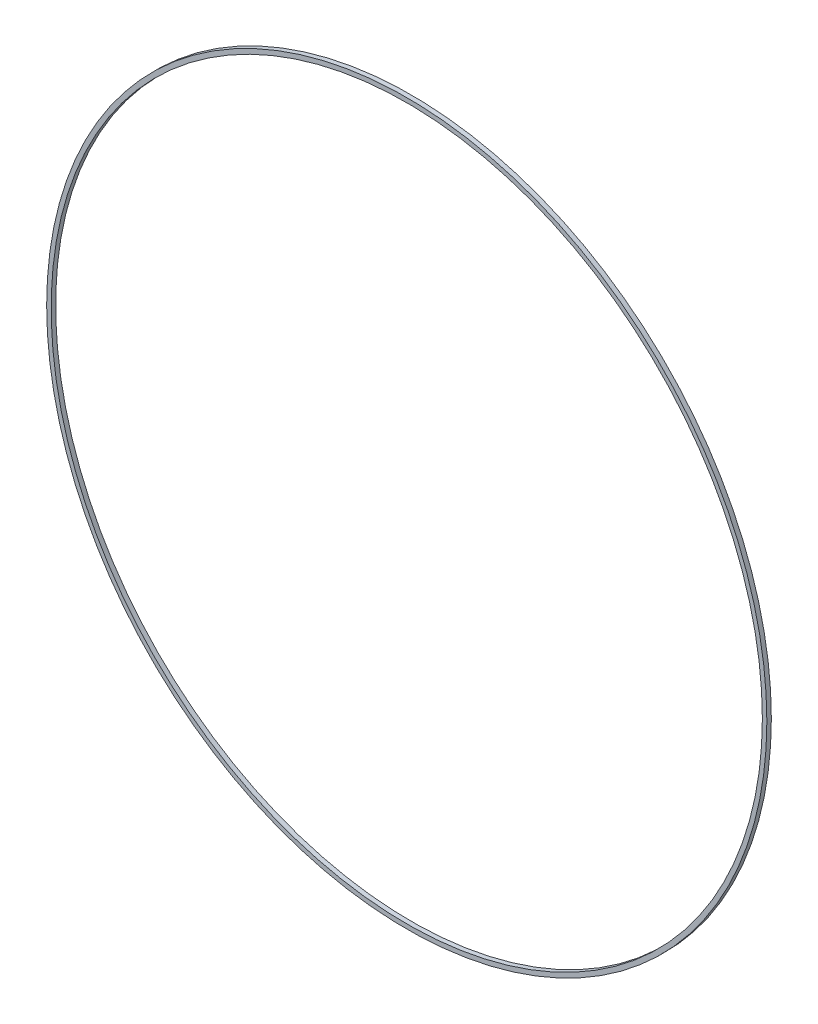
ISO-10303-21;
HEADER;
FILE_DESCRIPTION(('STEP AP214'),'2;1');
FILE_NAME('part.step','',(''),(''),'','','');
FILE_SCHEMA(('AUTOMOTIVE_DESIGN { 1 0 10303 214 1 1 1 1 }'));
ENDSEC;
DATA;
#1=APPLICATION_CONTEXT('core data for automotive mechanical design processes');
#2=APPLICATION_PROTOCOL_DEFINITION('international standard','automotive_design',2000,#1);
#3=PRODUCT_CONTEXT('',#1,'mechanical');
#4=PRODUCT('Part','Part','',(#3));
#5=PRODUCT_RELATED_PRODUCT_CATEGORY('part','',(#4));
#6=PRODUCT_DEFINITION_FORMATION('','',#4);
#7=PRODUCT_DEFINITION_CONTEXT('part definition',#1,'design');
#8=PRODUCT_DEFINITION('design','',#6,#7);
#9=PRODUCT_DEFINITION_SHAPE('','',#8);
#10=(LENGTH_UNIT() NAMED_UNIT(*) SI_UNIT(.MILLI.,.METRE.));
#11=(NAMED_UNIT(*) PLANE_ANGLE_UNIT() SI_UNIT($,.RADIAN.));
#12=(NAMED_UNIT(*) SI_UNIT($,.STERADIAN.) SOLID_ANGLE_UNIT());
#13=UNCERTAINTY_MEASURE_WITH_UNIT(LENGTH_MEASURE(1.E-05),#10,'distance_accuracy_value','');
#14=(GEOMETRIC_REPRESENTATION_CONTEXT(3) GLOBAL_UNCERTAINTY_ASSIGNED_CONTEXT((#13)) GLOBAL_UNIT_ASSIGNED_CONTEXT((#10,
#11,#12)) REPRESENTATION_CONTEXT('',''));
#15=CARTESIAN_POINT('',(0.,0.,0.));
#16=DIRECTION('',(0.,0.,1.));
#17=DIRECTION('',(1.,0.,0.));
#18=AXIS2_PLACEMENT_3D('',#15,#16,#17);
#19=CARTESIAN_POINT('',(-24.8525814188838,9.23037039899555,1.27));
#20=DIRECTION('',(0.,0.,1.));
#21=DIRECTION('',(1.,0.,0.));
#22=AXIS2_PLACEMENT_3D('',#19,#20,#21);
#23=PLANE('',#22);
#24=CARTESIAN_POINT('',(-24.8525814188838,9.23037039899555,1.27));
#25=DIRECTION('',(0.,0.,1.));
#26=DIRECTION('',(1.,0.,0.));
#27=AXIS2_PLACEMENT_3D('',#24,#25,#26);
#28=CIRCLE('',#27,101.671804802443);
#29=CARTESIAN_POINT('',(76.819223383559,9.23037039899555,1.27));
#30=VERTEX_POINT('',#29);
#31=EDGE_CURVE('E10',#30,#30,#28,.T.);
#32=ORIENTED_EDGE('',*,*,#31,.T.);
#33=EDGE_LOOP('',(#32));
#34=FACE_BOUND('',#33,.T.);
#35=CARTESIAN_POINT('',(-24.8525814188838,9.23037039899555,1.27));
#36=DIRECTION('',(0.,0.,1.));
#37=DIRECTION('',(1.,0.,0.));
#38=AXIS2_PLACEMENT_3D('',#35,#36,#37);
#39=CIRCLE('',#38,100.401804802443);
#40=CARTESIAN_POINT('',(75.549223383559,9.23037039899555,1.27));
#41=VERTEX_POINT('',#40);
#42=EDGE_CURVE('E40',#41,#41,#39,.T.);
#43=ORIENTED_EDGE('',*,*,#42,.F.);
#44=EDGE_LOOP('',(#43));
#45=FACE_BOUND('',#44,.T.);
#46=ADVANCED_FACE('F29',(#34,#45),#23,.T.);
#47=CARTESIAN_POINT('',(-24.8525814188838,9.23037039899555,0.));
#48=DIRECTION('',(0.,0.,1.));
#49=DIRECTION('',(1.,0.,0.));
#50=AXIS2_PLACEMENT_3D('',#47,#48,#49);
#51=PLANE('',#50);
#52=CARTESIAN_POINT('',(-24.8525814188838,9.23037039899555,0.));
#53=DIRECTION('',(0.,0.,1.));
#54=DIRECTION('',(1.,0.,0.));
#55=AXIS2_PLACEMENT_3D('',#52,#53,#54);
#56=CIRCLE('',#55,101.671804802443);
#57=CARTESIAN_POINT('',(76.819223383559,9.23037039899555,0.));
#58=VERTEX_POINT('',#57);
#59=EDGE_CURVE('E33',#58,#58,#56,.T.);
#60=ORIENTED_EDGE('',*,*,#59,.F.);
#61=EDGE_LOOP('',(#60));
#62=FACE_BOUND('',#61,.T.);
#63=CARTESIAN_POINT('',(-24.8525814188838,9.23037039899555,0.));
#64=DIRECTION('',(0.,0.,1.));
#65=DIRECTION('',(1.,0.,0.));
#66=AXIS2_PLACEMENT_3D('',#63,#64,#65);
#67=CIRCLE('',#66,100.401804802443);
#68=CARTESIAN_POINT('',(75.549223383559,9.23037039899555,0.));
#69=VERTEX_POINT('',#68);
#70=EDGE_CURVE('E42',#69,#69,#67,.T.);
#71=ORIENTED_EDGE('',*,*,#70,.T.);
#72=EDGE_LOOP('',(#71));
#73=FACE_BOUND('',#72,.T.);
#74=ADVANCED_FACE('F52',(#62,#73),#51,.F.);
#75=CARTESIAN_POINT('',(-24.8525814188838,9.23037039899555,1.27));
#76=DIRECTION('',(0.,0.,-1.));
#77=DIRECTION('',(-1.,0.,0.));
#78=AXIS2_PLACEMENT_3D('',#75,#76,#77);
#79=CYLINDRICAL_SURFACE('',#78,101.671804802443);
#80=ORIENTED_EDGE('',*,*,#31,.F.);
#81=EDGE_LOOP('',(#80));
#82=FACE_BOUND('',#81,.T.);
#83=ORIENTED_EDGE('',*,*,#59,.T.);
#84=EDGE_LOOP('',(#83));
#85=FACE_BOUND('',#84,.T.);
#86=ADVANCED_FACE('F31',(#82,#85),#79,.T.);
#87=CARTESIAN_POINT('',(-24.8525814188838,9.23037039899555,1.27));
#88=DIRECTION('',(0.,0.,-1.));
#89=DIRECTION('',(-1.,0.,0.));
#90=AXIS2_PLACEMENT_3D('',#87,#88,#89);
#91=CYLINDRICAL_SURFACE('',#90,100.401804802443);
#92=ORIENTED_EDGE('',*,*,#42,.T.);
#93=EDGE_LOOP('',(#92));
#94=FACE_BOUND('',#93,.T.);
#95=ORIENTED_EDGE('',*,*,#70,.F.);
#96=EDGE_LOOP('',(#95));
#97=FACE_BOUND('',#96,.T.);
#98=ADVANCED_FACE('F48',(#94,#97),#91,.F.);
#99=CLOSED_SHELL('',(#46,#74,#86,#98));
#100=MANIFOLD_SOLID_BREP('B2',#99);
#101=ADVANCED_BREP_SHAPE_REPRESENTATION('',(#18,#100),#14);
#102=SHAPE_DEFINITION_REPRESENTATION(#9,#101);
ENDSEC;
END-ISO-10303-21;
